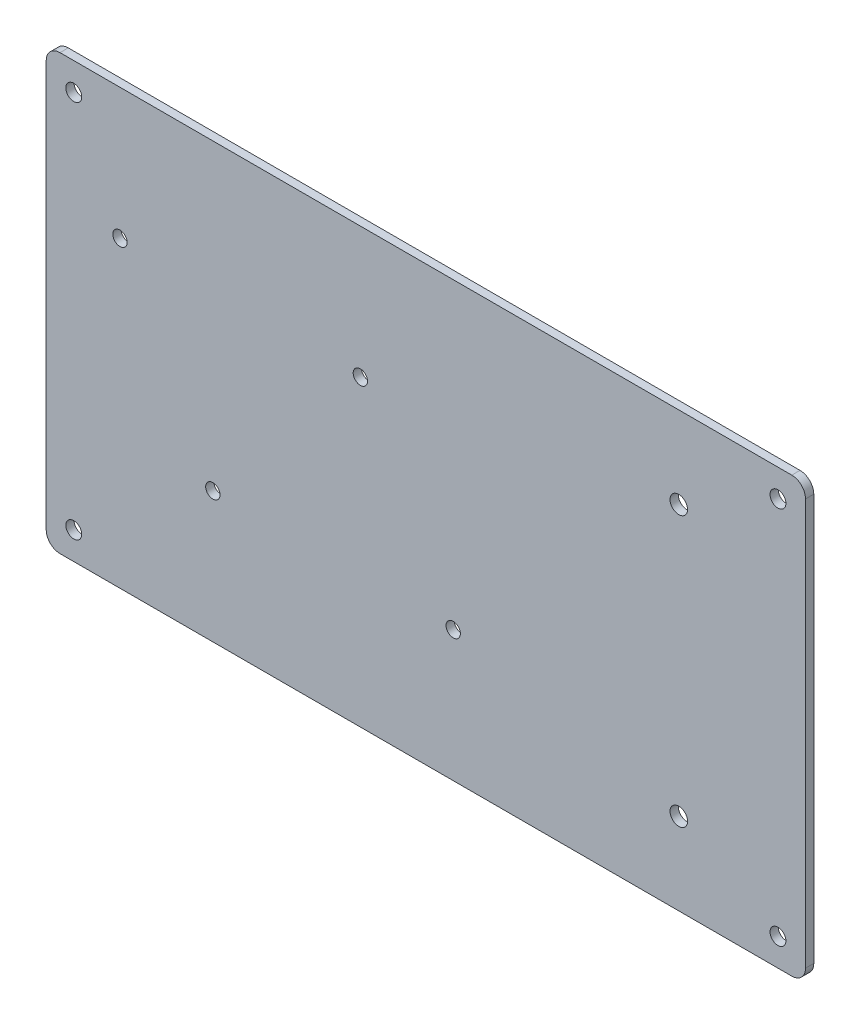
ISO-10303-21;
HEADER;
FILE_DESCRIPTION(('STEP AP214'),'2;1');
FILE_NAME('part.step','',(''),(''),'','','');
FILE_SCHEMA(('AUTOMOTIVE_DESIGN { 1 0 10303 214 1 1 1 1 }'));
ENDSEC;
DATA;
#1=APPLICATION_CONTEXT('core data for automotive mechanical design processes');
#2=APPLICATION_PROTOCOL_DEFINITION('international standard','automotive_design',2000,#1);
#3=PRODUCT_CONTEXT('',#1,'mechanical');
#4=PRODUCT('Part','Part','',(#3));
#5=PRODUCT_RELATED_PRODUCT_CATEGORY('part','',(#4));
#6=PRODUCT_DEFINITION_FORMATION('','',#4);
#7=PRODUCT_DEFINITION_CONTEXT('part definition',#1,'design');
#8=PRODUCT_DEFINITION('design','',#6,#7);
#9=PRODUCT_DEFINITION_SHAPE('','',#8);
#10=(LENGTH_UNIT() NAMED_UNIT(*) SI_UNIT(.MILLI.,.METRE.));
#11=(NAMED_UNIT(*) PLANE_ANGLE_UNIT() SI_UNIT($,.RADIAN.));
#12=(NAMED_UNIT(*) SI_UNIT($,.STERADIAN.) SOLID_ANGLE_UNIT());
#13=UNCERTAINTY_MEASURE_WITH_UNIT(LENGTH_MEASURE(1.E-05),#10,'distance_accuracy_value','');
#14=(GEOMETRIC_REPRESENTATION_CONTEXT(3) GLOBAL_UNCERTAINTY_ASSIGNED_CONTEXT((#13)) GLOBAL_UNIT_ASSIGNED_CONTEXT((#10,
#11,#12)) REPRESENTATION_CONTEXT('',''));
#15=CARTESIAN_POINT('',(0.,0.,0.));
#16=DIRECTION('',(0.,0.,1.));
#17=DIRECTION('',(1.,0.,0.));
#18=AXIS2_PLACEMENT_3D('',#15,#16,#17);
#19=CARTESIAN_POINT('',(87.5,-50.,1.9));
#20=DIRECTION('',(-1.,0.,0.));
#21=DIRECTION('',(0.,0.,1.));
#22=AXIS2_PLACEMENT_3D('',#19,#20,#21);
#23=PLANE('',#22);
#24=DIRECTION('',(0.,1.,0.));
#25=VECTOR('',#24,1.);
#26=CARTESIAN_POINT('',(87.5,-50.,1.9));
#27=LINE('',#26,#25);
#28=CARTESIAN_POINT('',(87.5,-46.825,1.9));
#29=VERTEX_POINT('',#28);
#30=CARTESIAN_POINT('',(87.5,46.825,1.9));
#31=VERTEX_POINT('',#30);
#32=EDGE_CURVE('E132',#29,#31,#27,.T.);
#33=ORIENTED_EDGE('',*,*,#32,.F.);
#34=DIRECTION('',(0.,0.,-1.));
#35=VECTOR('',#34,1.);
#36=CARTESIAN_POINT('',(87.5,-46.825,1.9));
#37=LINE('',#36,#35);
#38=CARTESIAN_POINT('',(87.5,-46.825,0.));
#39=VERTEX_POINT('',#38);
#40=EDGE_CURVE('E116',#29,#39,#37,.T.);
#41=ORIENTED_EDGE('',*,*,#40,.T.);
#42=DIRECTION('',(0.,1.,0.));
#43=VECTOR('',#42,1.);
#44=CARTESIAN_POINT('',(87.5,-50.,0.));
#45=LINE('',#44,#43);
#46=CARTESIAN_POINT('',(87.5,46.825,0.));
#47=VERTEX_POINT('',#46);
#48=EDGE_CURVE('E129',#39,#47,#45,.T.);
#49=ORIENTED_EDGE('',*,*,#48,.T.);
#50=DIRECTION('',(0.,0.,-1.));
#51=VECTOR('',#50,1.);
#52=CARTESIAN_POINT('',(87.5,46.825,1.9));
#53=LINE('',#52,#51);
#54=EDGE_CURVE('E135',#47,#31,#53,.F.);
#55=ORIENTED_EDGE('',*,*,#54,.T.);
#56=EDGE_LOOP('',(#33,#41,#49,#55));
#57=FACE_BOUND('',#56,.T.);
#58=ADVANCED_FACE('F45',(#57),#23,.F.);
#59=CARTESIAN_POINT('',(-87.5,50.,1.9));
#60=DIRECTION('',(0.,-1.,0.));
#61=DIRECTION('',(0.,0.,-1.));
#62=AXIS2_PLACEMENT_3D('',#59,#60,#61);
#63=PLANE('',#62);
#64=DIRECTION('',(-1.,0.,0.));
#65=VECTOR('',#64,1.);
#66=CARTESIAN_POINT('',(-87.5,50.,0.));
#67=LINE('',#66,#65);
#68=CARTESIAN_POINT('',(84.325,50.,0.));
#69=VERTEX_POINT('',#68);
#70=CARTESIAN_POINT('',(-84.325,50.,0.));
#71=VERTEX_POINT('',#70);
#72=EDGE_CURVE('E140',#69,#71,#67,.T.);
#73=ORIENTED_EDGE('',*,*,#72,.T.);
#74=DIRECTION('',(0.,0.,-1.));
#75=VECTOR('',#74,1.);
#76=CARTESIAN_POINT('',(-84.325,50.,1.9));
#77=LINE('',#76,#75);
#78=CARTESIAN_POINT('',(-84.325,50.,1.9));
#79=VERTEX_POINT('',#78);
#80=EDGE_CURVE('E11',#71,#79,#77,.F.);
#81=ORIENTED_EDGE('',*,*,#80,.T.);
#82=DIRECTION('',(-1.,0.,0.));
#83=VECTOR('',#82,1.);
#84=CARTESIAN_POINT('',(-87.5,50.,1.9));
#85=LINE('',#84,#83);
#86=CARTESIAN_POINT('',(84.325,50.,1.9));
#87=VERTEX_POINT('',#86);
#88=EDGE_CURVE('E209',#87,#79,#85,.T.);
#89=ORIENTED_EDGE('',*,*,#88,.F.);
#90=DIRECTION('',(0.,0.,-1.));
#91=VECTOR('',#90,1.);
#92=CARTESIAN_POINT('',(84.325,50.,1.9));
#93=LINE('',#92,#91);
#94=EDGE_CURVE('E54',#87,#69,#93,.T.);
#95=ORIENTED_EDGE('',*,*,#94,.T.);
#96=EDGE_LOOP('',(#73,#81,#89,#95));
#97=FACE_BOUND('',#96,.T.);
#98=ADVANCED_FACE('F207',(#97),#63,.F.);
#99=CARTESIAN_POINT('',(-87.5,-50.,1.9));
#100=DIRECTION('',(1.,0.,0.));
#101=DIRECTION('',(0.,0.,-1.));
#102=AXIS2_PLACEMENT_3D('',#99,#100,#101);
#103=PLANE('',#102);
#104=DIRECTION('',(0.,-1.,0.));
#105=VECTOR('',#104,1.);
#106=CARTESIAN_POINT('',(-87.5,-50.,0.));
#107=LINE('',#106,#105);
#108=CARTESIAN_POINT('',(-87.5,46.825,0.));
#109=VERTEX_POINT('',#108);
#110=CARTESIAN_POINT('',(-87.5,-46.825,0.));
#111=VERTEX_POINT('',#110);
#112=EDGE_CURVE('E146',#109,#111,#107,.T.);
#113=ORIENTED_EDGE('',*,*,#112,.T.);
#114=DIRECTION('',(0.,0.,-1.));
#115=VECTOR('',#114,1.);
#116=CARTESIAN_POINT('',(-87.5,-46.825,1.9));
#117=LINE('',#116,#115);
#118=CARTESIAN_POINT('',(-87.5,-46.825,1.9));
#119=VERTEX_POINT('',#118);
#120=EDGE_CURVE('E61',#111,#119,#117,.F.);
#121=ORIENTED_EDGE('',*,*,#120,.T.);
#122=DIRECTION('',(0.,-1.,0.));
#123=VECTOR('',#122,1.);
#124=CARTESIAN_POINT('',(-87.5,-50.,1.9));
#125=LINE('',#124,#123);
#126=CARTESIAN_POINT('',(-87.5,46.825,1.9));
#127=VERTEX_POINT('',#126);
#128=EDGE_CURVE('E217',#127,#119,#125,.T.);
#129=ORIENTED_EDGE('',*,*,#128,.F.);
#130=DIRECTION('',(0.,0.,-1.));
#131=VECTOR('',#130,1.);
#132=CARTESIAN_POINT('',(-87.5,46.825,1.9));
#133=LINE('',#132,#131);
#134=EDGE_CURVE('E197',#127,#109,#133,.T.);
#135=ORIENTED_EDGE('',*,*,#134,.T.);
#136=EDGE_LOOP('',(#113,#121,#129,#135));
#137=FACE_BOUND('',#136,.T.);
#138=ADVANCED_FACE('F216',(#137),#103,.F.);
#139=CARTESIAN_POINT('',(-87.5,-50.,1.9));
#140=DIRECTION('',(0.,1.,0.));
#141=DIRECTION('',(0.,0.,1.));
#142=AXIS2_PLACEMENT_3D('',#139,#140,#141);
#143=PLANE('',#142);
#144=DIRECTION('',(1.,0.,0.));
#145=VECTOR('',#144,1.);
#146=CARTESIAN_POINT('',(-87.5,-50.,0.));
#147=LINE('',#146,#145);
#148=CARTESIAN_POINT('',(-84.325,-50.,0.));
#149=VERTEX_POINT('',#148);
#150=CARTESIAN_POINT('',(84.325,-50.,0.));
#151=VERTEX_POINT('',#150);
#152=EDGE_CURVE('E157',#149,#151,#147,.T.);
#153=ORIENTED_EDGE('',*,*,#152,.T.);
#154=DIRECTION('',(0.,0.,-1.));
#155=VECTOR('',#154,1.);
#156=CARTESIAN_POINT('',(84.325,-50.,1.9));
#157=LINE('',#156,#155);
#158=CARTESIAN_POINT('',(84.325,-50.,1.9));
#159=VERTEX_POINT('',#158);
#160=EDGE_CURVE('E117',#151,#159,#157,.F.);
#161=ORIENTED_EDGE('',*,*,#160,.T.);
#162=DIRECTION('',(1.,0.,0.));
#163=VECTOR('',#162,1.);
#164=CARTESIAN_POINT('',(-87.5,-50.,1.9));
#165=LINE('',#164,#163);
#166=CARTESIAN_POINT('',(-84.325,-50.,1.9));
#167=VERTEX_POINT('',#166);
#168=EDGE_CURVE('E152',#167,#159,#165,.T.);
#169=ORIENTED_EDGE('',*,*,#168,.F.);
#170=DIRECTION('',(0.,0.,-1.));
#171=VECTOR('',#170,1.);
#172=CARTESIAN_POINT('',(-84.325,-50.,1.9));
#173=LINE('',#172,#171);
#174=EDGE_CURVE('E123',#167,#149,#173,.T.);
#175=ORIENTED_EDGE('',*,*,#174,.T.);
#176=EDGE_LOOP('',(#153,#161,#169,#175));
#177=FACE_BOUND('',#176,.T.);
#178=ADVANCED_FACE('F304',(#177),#143,.F.);
#179=CARTESIAN_POINT('',(0.,0.,1.9));
#180=DIRECTION('',(0.,0.,-1.));
#181=DIRECTION('',(-1.,0.,0.));
#182=AXIS2_PLACEMENT_3D('',#179,#180,#181);
#183=PLANE('',#182);
#184=CARTESIAN_POINT('',(58.2899999999999,31.115,1.9));
#185=DIRECTION('',(0.,0.,1.));
#186=DIRECTION('',(1.,0.,0.));
#187=AXIS2_PLACEMENT_3D('',#184,#185,#186);
#188=CIRCLE('',#187,2.0193);
#189=CARTESIAN_POINT('',(60.3092999999999,31.115,1.9));
#190=VERTEX_POINT('',#189);
#191=EDGE_CURVE('E251',#190,#190,#188,.T.);
#192=ORIENTED_EDGE('',*,*,#191,.F.);
#193=EDGE_LOOP('',(#192));
#194=FACE_BOUND('',#193,.T.);
#195=CARTESIAN_POINT('',(-70.4999999999999,19.85,1.9));
#196=DIRECTION('',(0.,0.,1.));
#197=DIRECTION('',(1.,0.,0.));
#198=AXIS2_PLACEMENT_3D('',#195,#196,#197);
#199=CIRCLE('',#198,1.65000000000002);
#200=CARTESIAN_POINT('',(-68.8499999999998,19.85,1.9));
#201=VERTEX_POINT('',#200);
#202=EDGE_CURVE('E269',#201,#201,#199,.T.);
#203=ORIENTED_EDGE('',*,*,#202,.F.);
#204=EDGE_LOOP('',(#203));
#205=FACE_BOUND('',#204,.T.);
#206=CARTESIAN_POINT('',(6.30000000000004,-19.85,1.9));
#207=DIRECTION('',(0.,0.,1.));
#208=DIRECTION('',(1.,0.,0.));
#209=AXIS2_PLACEMENT_3D('',#206,#207,#208);
#210=CIRCLE('',#209,1.65000000000001);
#211=CARTESIAN_POINT('',(7.95000000000005,-19.85,1.9));
#212=VERTEX_POINT('',#211);
#213=EDGE_CURVE('E260',#212,#212,#210,.T.);
#214=ORIENTED_EDGE('',*,*,#213,.F.);
#215=EDGE_LOOP('',(#214));
#216=FACE_BOUND('',#215,.T.);
#217=CARTESIAN_POINT('',(-15.1,19.85,1.9));
#218=DIRECTION('',(0.,0.,1.));
#219=DIRECTION('',(1.,0.,0.));
#220=AXIS2_PLACEMENT_3D('',#217,#218,#219);
#221=CIRCLE('',#220,1.65);
#222=CARTESIAN_POINT('',(-13.45,19.85,1.9));
#223=VERTEX_POINT('',#222);
#224=EDGE_CURVE('E283',#223,#223,#221,.T.);
#225=ORIENTED_EDGE('',*,*,#224,.F.);
#226=EDGE_LOOP('',(#225));
#227=FACE_BOUND('',#226,.T.);
#228=CARTESIAN_POINT('',(58.2899999999999,-31.115,1.9));
#229=DIRECTION('',(0.,0.,1.));
#230=DIRECTION('',(1.,0.,0.));
#231=AXIS2_PLACEMENT_3D('',#228,#229,#230);
#232=CIRCLE('',#231,2.0193);
#233=CARTESIAN_POINT('',(60.3092999999999,-31.115,1.9));
#234=VERTEX_POINT('',#233);
#235=EDGE_CURVE('E259',#234,#234,#232,.T.);
#236=ORIENTED_EDGE('',*,*,#235,.F.);
#237=EDGE_LOOP('',(#236));
#238=FACE_BOUND('',#237,.T.);
#239=CARTESIAN_POINT('',(-49.0999999999999,-19.85,1.9));
#240=DIRECTION('',(0.,0.,1.));
#241=DIRECTION('',(1.,0.,0.));
#242=AXIS2_PLACEMENT_3D('',#239,#240,#241);
#243=CIRCLE('',#242,1.65);
#244=CARTESIAN_POINT('',(-47.4499999999998,-19.85,1.9));
#245=VERTEX_POINT('',#244);
#246=EDGE_CURVE('E242',#245,#245,#243,.T.);
#247=ORIENTED_EDGE('',*,*,#246,.F.);
#248=EDGE_LOOP('',(#247));
#249=FACE_BOUND('',#248,.T.);
#250=CARTESIAN_POINT('',(81.15,-43.65,1.9));
#251=DIRECTION('',(0.,0.,-1.));
#252=DIRECTION('',(-1.,0.,0.));
#253=AXIS2_PLACEMENT_3D('',#250,#251,#252);
#254=CIRCLE('',#253,1.8288);
#255=CARTESIAN_POINT('',(82.9788,-43.65,1.9));
#256=VERTEX_POINT('',#255);
#257=EDGE_CURVE('E230',#256,#256,#254,.F.);
#258=ORIENTED_EDGE('',*,*,#257,.F.);
#259=EDGE_LOOP('',(#258));
#260=FACE_BOUND('',#259,.T.);
#261=CARTESIAN_POINT('',(-81.15,43.65,1.9));
#262=DIRECTION('',(0.,0.,-1.));
#263=DIRECTION('',(-1.,0.,0.));
#264=AXIS2_PLACEMENT_3D('',#261,#262,#263);
#265=CIRCLE('',#264,1.8288);
#266=CARTESIAN_POINT('',(-79.3212,43.65,1.9));
#267=VERTEX_POINT('',#266);
#268=EDGE_CURVE('E231',#267,#267,#265,.F.);
#269=ORIENTED_EDGE('',*,*,#268,.F.);
#270=EDGE_LOOP('',(#269));
#271=FACE_BOUND('',#270,.T.);
#272=CARTESIAN_POINT('',(-81.15,-43.65,1.9));
#273=DIRECTION('',(0.,0.,-1.));
#274=DIRECTION('',(-1.,0.,0.));
#275=AXIS2_PLACEMENT_3D('',#272,#273,#274);
#276=CIRCLE('',#275,1.8288);
#277=CARTESIAN_POINT('',(-79.3212,-43.65,1.9));
#278=VERTEX_POINT('',#277);
#279=EDGE_CURVE('E235',#278,#278,#276,.F.);
#280=ORIENTED_EDGE('',*,*,#279,.F.);
#281=EDGE_LOOP('',(#280));
#282=FACE_BOUND('',#281,.T.);
#283=CARTESIAN_POINT('',(81.15,43.65,1.9));
#284=DIRECTION('',(0.,0.,-1.));
#285=DIRECTION('',(-1.,0.,0.));
#286=AXIS2_PLACEMENT_3D('',#283,#284,#285);
#287=CIRCLE('',#286,1.8288);
#288=CARTESIAN_POINT('',(82.9788,43.65,1.9));
#289=VERTEX_POINT('',#288);
#290=EDGE_CURVE('E165',#289,#289,#287,.F.);
#291=ORIENTED_EDGE('',*,*,#290,.F.);
#292=EDGE_LOOP('',(#291));
#293=FACE_BOUND('',#292,.T.);
#294=ORIENTED_EDGE('',*,*,#168,.T.);
#295=CARTESIAN_POINT('',(84.325,-46.825,1.9));
#296=DIRECTION('',(0.,0.,-1.));
#297=DIRECTION('',(-1.,0.,0.));
#298=AXIS2_PLACEMENT_3D('',#295,#296,#297);
#299=CIRCLE('',#298,3.175);
#300=EDGE_CURVE('E194',#159,#29,#299,.F.);
#301=ORIENTED_EDGE('',*,*,#300,.T.);
#302=ORIENTED_EDGE('',*,*,#32,.T.);
#303=CARTESIAN_POINT('',(84.325,46.825,1.9));
#304=DIRECTION('',(0.,0.,-1.));
#305=DIRECTION('',(-1.,0.,0.));
#306=AXIS2_PLACEMENT_3D('',#303,#304,#305);
#307=CIRCLE('',#306,3.175);
#308=EDGE_CURVE('E186',#31,#87,#307,.F.);
#309=ORIENTED_EDGE('',*,*,#308,.T.);
#310=ORIENTED_EDGE('',*,*,#88,.T.);
#311=CARTESIAN_POINT('',(-84.325,46.825,1.9));
#312=DIRECTION('',(0.,0.,-1.));
#313=DIRECTION('',(-1.,0.,0.));
#314=AXIS2_PLACEMENT_3D('',#311,#312,#313);
#315=CIRCLE('',#314,3.175);
#316=EDGE_CURVE('E68',#79,#127,#315,.F.);
#317=ORIENTED_EDGE('',*,*,#316,.T.);
#318=ORIENTED_EDGE('',*,*,#128,.T.);
#319=CARTESIAN_POINT('',(-84.325,-46.825,1.9));
#320=DIRECTION('',(0.,0.,-1.));
#321=DIRECTION('',(-1.,0.,0.));
#322=AXIS2_PLACEMENT_3D('',#319,#320,#321);
#323=CIRCLE('',#322,3.175);
#324=EDGE_CURVE('E191',#119,#167,#323,.F.);
#325=ORIENTED_EDGE('',*,*,#324,.T.);
#326=EDGE_LOOP('',(#294,#301,#302,#309,#310,#317,#318,#325));
#327=FACE_BOUND('',#326,.T.);
#328=ADVANCED_FACE('F301',(#194,#205,#216,#227,#238,#249,#260,#271,#282,#293,#327),#183,.F.);
#329=CARTESIAN_POINT('',(0.,0.,0.));
#330=DIRECTION('',(0.,0.,-1.));
#331=DIRECTION('',(-1.,0.,0.));
#332=AXIS2_PLACEMENT_3D('',#329,#330,#331);
#333=PLANE('',#332);
#334=CARTESIAN_POINT('',(58.2899999999999,31.115,0.));
#335=DIRECTION('',(0.,0.,-1.));
#336=DIRECTION('',(-1.,0.,0.));
#337=AXIS2_PLACEMENT_3D('',#334,#335,#336);
#338=CIRCLE('',#337,2.0193);
#339=CARTESIAN_POINT('',(56.2706999999999,31.115,0.));
#340=VERTEX_POINT('',#339);
#341=EDGE_CURVE('E255',#340,#340,#338,.F.);
#342=ORIENTED_EDGE('',*,*,#341,.T.);
#343=EDGE_LOOP('',(#342));
#344=FACE_BOUND('',#343,.T.);
#345=CARTESIAN_POINT('',(-70.4999999999999,19.85,0.));
#346=DIRECTION('',(0.,0.,-1.));
#347=DIRECTION('',(-1.,0.,0.));
#348=AXIS2_PLACEMENT_3D('',#345,#346,#347);
#349=CIRCLE('',#348,1.65000000000002);
#350=CARTESIAN_POINT('',(-72.1499999999999,19.85,0.));
#351=VERTEX_POINT('',#350);
#352=EDGE_CURVE('E247',#351,#351,#349,.F.);
#353=ORIENTED_EDGE('',*,*,#352,.T.);
#354=EDGE_LOOP('',(#353));
#355=FACE_BOUND('',#354,.T.);
#356=CARTESIAN_POINT('',(6.30000000000004,-19.85,0.));
#357=DIRECTION('',(0.,0.,-1.));
#358=DIRECTION('',(-1.,0.,0.));
#359=AXIS2_PLACEMENT_3D('',#356,#357,#358);
#360=CIRCLE('',#359,1.65000000000001);
#361=CARTESIAN_POINT('',(4.65000000000004,-19.85,0.));
#362=VERTEX_POINT('',#361);
#363=EDGE_CURVE('E264',#362,#362,#360,.F.);
#364=ORIENTED_EDGE('',*,*,#363,.T.);
#365=EDGE_LOOP('',(#364));
#366=FACE_BOUND('',#365,.T.);
#367=CARTESIAN_POINT('',(-15.1,19.85,0.));
#368=DIRECTION('',(0.,0.,-1.));
#369=DIRECTION('',(-1.,0.,0.));
#370=AXIS2_PLACEMENT_3D('',#367,#368,#369);
#371=CIRCLE('',#370,1.65);
#372=CARTESIAN_POINT('',(-16.75,19.85,0.));
#373=VERTEX_POINT('',#372);
#374=EDGE_CURVE('E265',#373,#373,#371,.F.);
#375=ORIENTED_EDGE('',*,*,#374,.T.);
#376=EDGE_LOOP('',(#375));
#377=FACE_BOUND('',#376,.T.);
#378=CARTESIAN_POINT('',(58.2899999999999,-31.115,0.));
#379=DIRECTION('',(0.,0.,-1.));
#380=DIRECTION('',(-1.,0.,0.));
#381=AXIS2_PLACEMENT_3D('',#378,#379,#380);
#382=CIRCLE('',#381,2.0193);
#383=CARTESIAN_POINT('',(56.2706999999999,-31.115,0.));
#384=VERTEX_POINT('',#383);
#385=EDGE_CURVE('E279',#384,#384,#382,.F.);
#386=ORIENTED_EDGE('',*,*,#385,.T.);
#387=EDGE_LOOP('',(#386));
#388=FACE_BOUND('',#387,.T.);
#389=CARTESIAN_POINT('',(-49.0999999999999,-19.85,0.));
#390=DIRECTION('',(0.,0.,-1.));
#391=DIRECTION('',(-1.,0.,0.));
#392=AXIS2_PLACEMENT_3D('',#389,#390,#391);
#393=CIRCLE('',#392,1.65);
#394=CARTESIAN_POINT('',(-50.7499999999999,-19.85,0.));
#395=VERTEX_POINT('',#394);
#396=EDGE_CURVE('E243',#395,#395,#393,.F.);
#397=ORIENTED_EDGE('',*,*,#396,.T.);
#398=EDGE_LOOP('',(#397));
#399=FACE_BOUND('',#398,.T.);
#400=CARTESIAN_POINT('',(81.15,-43.65,0.));
#401=DIRECTION('',(0.,0.,-1.));
#402=DIRECTION('',(-1.,0.,0.));
#403=AXIS2_PLACEMENT_3D('',#400,#401,#402);
#404=CIRCLE('',#403,1.8288);
#405=CARTESIAN_POINT('',(82.9788,-43.65,0.));
#406=VERTEX_POINT('',#405);
#407=EDGE_CURVE('E141',#406,#406,#404,.F.);
#408=ORIENTED_EDGE('',*,*,#407,.T.);
#409=EDGE_LOOP('',(#408));
#410=FACE_BOUND('',#409,.T.);
#411=CARTESIAN_POINT('',(-81.15,43.65,0.));
#412=DIRECTION('',(0.,0.,-1.));
#413=DIRECTION('',(-1.,0.,0.));
#414=AXIS2_PLACEMENT_3D('',#411,#412,#413);
#415=CIRCLE('',#414,1.8288);
#416=CARTESIAN_POINT('',(-79.3212,43.65,0.));
#417=VERTEX_POINT('',#416);
#418=EDGE_CURVE('E149',#417,#417,#415,.F.);
#419=ORIENTED_EDGE('',*,*,#418,.T.);
#420=EDGE_LOOP('',(#419));
#421=FACE_BOUND('',#420,.T.);
#422=CARTESIAN_POINT('',(-81.15,-43.65,0.));
#423=DIRECTION('',(0.,0.,-1.));
#424=DIRECTION('',(-1.,0.,0.));
#425=AXIS2_PLACEMENT_3D('',#422,#423,#424);
#426=CIRCLE('',#425,1.8288);
#427=CARTESIAN_POINT('',(-79.3212,-43.65,0.));
#428=VERTEX_POINT('',#427);
#429=EDGE_CURVE('E164',#428,#428,#426,.F.);
#430=ORIENTED_EDGE('',*,*,#429,.T.);
#431=EDGE_LOOP('',(#430));
#432=FACE_BOUND('',#431,.T.);
#433=CARTESIAN_POINT('',(81.15,43.65,0.));
#434=DIRECTION('',(0.,0.,-1.));
#435=DIRECTION('',(-1.,0.,0.));
#436=AXIS2_PLACEMENT_3D('',#433,#434,#435);
#437=CIRCLE('',#436,1.8288);
#438=CARTESIAN_POINT('',(82.9788,43.65,0.));
#439=VERTEX_POINT('',#438);
#440=EDGE_CURVE('E160',#439,#439,#437,.F.);
#441=ORIENTED_EDGE('',*,*,#440,.T.);
#442=EDGE_LOOP('',(#441));
#443=FACE_BOUND('',#442,.T.);
#444=ORIENTED_EDGE('',*,*,#48,.F.);
#445=CARTESIAN_POINT('',(84.325,-46.825,0.));
#446=DIRECTION('',(0.,0.,-1.));
#447=DIRECTION('',(-1.,0.,0.));
#448=AXIS2_PLACEMENT_3D('',#445,#446,#447);
#449=CIRCLE('',#448,3.175);
#450=EDGE_CURVE('E112',#39,#151,#449,.T.);
#451=ORIENTED_EDGE('',*,*,#450,.T.);
#452=ORIENTED_EDGE('',*,*,#152,.F.);
#453=CARTESIAN_POINT('',(-84.325,-46.825,0.));
#454=DIRECTION('',(0.,0.,-1.));
#455=DIRECTION('',(-1.,0.,0.));
#456=AXIS2_PLACEMENT_3D('',#453,#454,#455);
#457=CIRCLE('',#456,3.175);
#458=EDGE_CURVE('E124',#149,#111,#457,.T.);
#459=ORIENTED_EDGE('',*,*,#458,.T.);
#460=ORIENTED_EDGE('',*,*,#112,.F.);
#461=CARTESIAN_POINT('',(-84.325,46.825,0.));
#462=DIRECTION('',(0.,0.,-1.));
#463=DIRECTION('',(-1.,0.,0.));
#464=AXIS2_PLACEMENT_3D('',#461,#462,#463);
#465=CIRCLE('',#464,3.175);
#466=EDGE_CURVE('E176',#109,#71,#465,.T.);
#467=ORIENTED_EDGE('',*,*,#466,.T.);
#468=ORIENTED_EDGE('',*,*,#72,.F.);
#469=CARTESIAN_POINT('',(84.325,46.825,0.));
#470=DIRECTION('',(0.,0.,-1.));
#471=DIRECTION('',(-1.,0.,0.));
#472=AXIS2_PLACEMENT_3D('',#469,#470,#471);
#473=CIRCLE('',#472,3.175);
#474=EDGE_CURVE('E134',#69,#47,#473,.T.);
#475=ORIENTED_EDGE('',*,*,#474,.T.);
#476=EDGE_LOOP('',(#444,#451,#452,#459,#460,#467,#468,#475));
#477=FACE_BOUND('',#476,.T.);
#478=ADVANCED_FACE('F137',(#344,#355,#366,#377,#388,#399,#410,#421,#432,#443,#477),#333,.T.);
#479=CARTESIAN_POINT('',(81.15,43.65,-1.2E-05));
#480=DIRECTION('',(0.,0.,1.));
#481=DIRECTION('',(1.,0.,0.));
#482=AXIS2_PLACEMENT_3D('',#479,#480,#481);
#483=CYLINDRICAL_SURFACE('',#482,1.8288);
#484=CARTESIAN_POINT('',(82.9788,43.65,0.));
#485=CARTESIAN_POINT('',(82.9788,43.65,0.0197916666666667));
#486=CARTESIAN_POINT('',(82.9788,43.65,0.0395833333333334));
#487=CARTESIAN_POINT('',(82.9788,43.65,0.0791666666666667));
#488=CARTESIAN_POINT('',(82.9788,43.65,0.0989583333333333));
#489=CARTESIAN_POINT('',(82.9788,43.65,0.138541666666667));
#490=CARTESIAN_POINT('',(82.9788,43.65,0.158333333333333));
#491=CARTESIAN_POINT('',(82.9788,43.65,0.197916666666667));
#492=CARTESIAN_POINT('',(82.9788,43.65,0.217708333333333));
#493=CARTESIAN_POINT('',(82.9788,43.65,0.257291666666667));
#494=CARTESIAN_POINT('',(82.9788,43.65,0.277083333333333));
#495=CARTESIAN_POINT('',(82.9788,43.65,0.316666666666667));
#496=CARTESIAN_POINT('',(82.9788,43.65,0.336458333333333));
#497=CARTESIAN_POINT('',(82.9788,43.65,0.376041666666667));
#498=CARTESIAN_POINT('',(82.9788,43.65,0.395833333333333));
#499=CARTESIAN_POINT('',(82.9788,43.65,0.435416666666667));
#500=CARTESIAN_POINT('',(82.9788,43.65,0.455208333333333));
#501=CARTESIAN_POINT('',(82.9788,43.65,0.494791666666667));
#502=CARTESIAN_POINT('',(82.9788,43.65,0.514583333333333));
#503=CARTESIAN_POINT('',(82.9788,43.65,0.554166666666667));
#504=CARTESIAN_POINT('',(82.9788,43.65,0.573958333333333));
#505=CARTESIAN_POINT('',(82.9788,43.65,0.613541666666667));
#506=CARTESIAN_POINT('',(82.9788,43.65,0.633333333333333));
#507=CARTESIAN_POINT('',(82.9788,43.65,0.672916666666667));
#508=CARTESIAN_POINT('',(82.9788,43.65,0.692708333333333));
#509=CARTESIAN_POINT('',(82.9788,43.65,0.732291666666667));
#510=CARTESIAN_POINT('',(82.9788,43.65,0.752083333333333));
#511=CARTESIAN_POINT('',(82.9788,43.65,0.791666666666667));
#512=CARTESIAN_POINT('',(82.9788,43.65,0.811458333333333));
#513=CARTESIAN_POINT('',(82.9788,43.65,0.851041666666667));
#514=CARTESIAN_POINT('',(82.9788,43.65,0.870833333333333));
#515=CARTESIAN_POINT('',(82.9788,43.65,0.910416666666667));
#516=CARTESIAN_POINT('',(82.9788,43.65,0.930208333333333));
#517=CARTESIAN_POINT('',(82.9788,43.65,0.969791666666667));
#518=CARTESIAN_POINT('',(82.9788,43.65,0.989583333333333));
#519=CARTESIAN_POINT('',(82.9788,43.65,1.02916666666667));
#520=CARTESIAN_POINT('',(82.9788,43.65,1.04895833333333));
#521=CARTESIAN_POINT('',(82.9788,43.65,1.08854166666667));
#522=CARTESIAN_POINT('',(82.9788,43.65,1.10833333333333));
#523=CARTESIAN_POINT('',(82.9788,43.65,1.14791666666667));
#524=CARTESIAN_POINT('',(82.9788,43.65,1.16770833333333));
#525=CARTESIAN_POINT('',(82.9788,43.65,1.20729166666667));
#526=CARTESIAN_POINT('',(82.9788,43.65,1.22708333333333));
#527=CARTESIAN_POINT('',(82.9788,43.65,1.26666666666667));
#528=CARTESIAN_POINT('',(82.9788,43.65,1.28645833333333));
#529=CARTESIAN_POINT('',(82.9788,43.65,1.32604166666667));
#530=CARTESIAN_POINT('',(82.9788,43.65,1.34583333333333));
#531=CARTESIAN_POINT('',(82.9788,43.65,1.38541666666667));
#532=CARTESIAN_POINT('',(82.9788,43.65,1.40520833333333));
#533=CARTESIAN_POINT('',(82.9788,43.65,1.44479166666667));
#534=CARTESIAN_POINT('',(82.9788,43.65,1.46458333333333));
#535=CARTESIAN_POINT('',(82.9788,43.65,1.50416666666667));
#536=CARTESIAN_POINT('',(82.9788,43.65,1.52395833333333));
#537=CARTESIAN_POINT('',(82.9788,43.65,1.56354166666667));
#538=CARTESIAN_POINT('',(82.9788,43.65,1.58333333333333));
#539=CARTESIAN_POINT('',(82.9788,43.65,1.62291666666667));
#540=CARTESIAN_POINT('',(82.9788,43.65,1.64270833333333));
#541=CARTESIAN_POINT('',(82.9788,43.65,1.68229166666667));
#542=CARTESIAN_POINT('',(82.9788,43.65,1.70208333333333));
#543=CARTESIAN_POINT('',(82.9788,43.65,1.74166666666667));
#544=CARTESIAN_POINT('',(82.9788,43.65,1.76145833333333));
#545=CARTESIAN_POINT('',(82.9788,43.65,1.80104166666667));
#546=CARTESIAN_POINT('',(82.9788,43.65,1.82083333333333));
#547=CARTESIAN_POINT('',(82.9788,43.65,1.86041666666667));
#548=CARTESIAN_POINT('',(82.9788,43.65,1.88020833333333));
#549=CARTESIAN_POINT('',(82.9788,43.65,1.9));
#550=B_SPLINE_CURVE_WITH_KNOTS('',3,(#484,#485,#486,#487,#488,#489,#490,#491,#492,#493,#494,
#495,#496,#497,#498,#499,#500,#501,#502,#503,#504,#505,#506,#507,#508,#509,#510,#511,#512,#513,
#514,#515,#516,#517,#518,#519,#520,#521,#522,#523,#524,#525,#526,#527,#528,#529,#530,#531,#532,
#533,#534,#535,#536,#537,#538,#539,#540,#541,#542,#543,#544,#545,#546,#547,#548,#549),
.UNSPECIFIED.,.F.,.F.,(4,2,2,2,2,2,2,2,2,2,2,2,2,2,2,2,2,2,2,2,2,2,2,2,2,2,2,2,2,2,2,2,4),(0.,
0.059375,0.11875,0.178125,0.2375,0.296875,0.35625,0.415625,0.475,0.534375,0.59375,0.653125,
0.7125,0.771875,0.83125,0.890625,0.95,1.009375,1.06875,1.128125,1.1875,1.246875,1.30625,
1.365625,1.425,1.484375,1.54375,1.603125,1.6625,1.721875,1.78125,1.840625,1.9),.UNSPECIFIED.);
#551=EDGE_CURVE('BSEAM344',#439,#289,#550,.T.);
#552=ORIENTED_EDGE('',*,*,#440,.F.);
#553=ORIENTED_EDGE('',*,*,#290,.T.);
#554=ORIENTED_EDGE('',*,*,#551,.T.);
#555=ORIENTED_EDGE('',*,*,#551,.F.);
#556=EDGE_LOOP('',(#552,#554,#553,#555));
#557=FACE_BOUND('',#556,.T.);
#558=ADVANCED_FACE('F344',(#557),#483,.F.);
#559=CARTESIAN_POINT('',(-81.15,-43.65,-1.2E-05));
#560=DIRECTION('',(0.,0.,1.));
#561=DIRECTION('',(1.,0.,0.));
#562=AXIS2_PLACEMENT_3D('',#559,#560,#561);
#563=CYLINDRICAL_SURFACE('',#562,1.8288);
#564=CARTESIAN_POINT('',(-79.3212,-43.65,0.));
#565=CARTESIAN_POINT('',(-79.3212,-43.65,0.0197916666666667));
#566=CARTESIAN_POINT('',(-79.3212,-43.65,0.0395833333333334));
#567=CARTESIAN_POINT('',(-79.3212,-43.65,0.0791666666666667));
#568=CARTESIAN_POINT('',(-79.3212,-43.65,0.0989583333333333));
#569=CARTESIAN_POINT('',(-79.3212,-43.65,0.138541666666667));
#570=CARTESIAN_POINT('',(-79.3212,-43.65,0.158333333333333));
#571=CARTESIAN_POINT('',(-79.3212,-43.65,0.197916666666667));
#572=CARTESIAN_POINT('',(-79.3212,-43.65,0.217708333333333));
#573=CARTESIAN_POINT('',(-79.3212,-43.65,0.257291666666667));
#574=CARTESIAN_POINT('',(-79.3212,-43.65,0.277083333333333));
#575=CARTESIAN_POINT('',(-79.3212,-43.65,0.316666666666667));
#576=CARTESIAN_POINT('',(-79.3212,-43.65,0.336458333333333));
#577=CARTESIAN_POINT('',(-79.3212,-43.65,0.376041666666667));
#578=CARTESIAN_POINT('',(-79.3212,-43.65,0.395833333333333));
#579=CARTESIAN_POINT('',(-79.3212,-43.65,0.435416666666667));
#580=CARTESIAN_POINT('',(-79.3212,-43.65,0.455208333333333));
#581=CARTESIAN_POINT('',(-79.3212,-43.65,0.494791666666667));
#582=CARTESIAN_POINT('',(-79.3212,-43.65,0.514583333333333));
#583=CARTESIAN_POINT('',(-79.3212,-43.65,0.554166666666667));
#584=CARTESIAN_POINT('',(-79.3212,-43.65,0.573958333333333));
#585=CARTESIAN_POINT('',(-79.3212,-43.65,0.613541666666667));
#586=CARTESIAN_POINT('',(-79.3212,-43.65,0.633333333333333));
#587=CARTESIAN_POINT('',(-79.3212,-43.65,0.672916666666667));
#588=CARTESIAN_POINT('',(-79.3212,-43.65,0.692708333333333));
#589=CARTESIAN_POINT('',(-79.3212,-43.65,0.732291666666667));
#590=CARTESIAN_POINT('',(-79.3212,-43.65,0.752083333333333));
#591=CARTESIAN_POINT('',(-79.3212,-43.65,0.791666666666667));
#592=CARTESIAN_POINT('',(-79.3212,-43.65,0.811458333333333));
#593=CARTESIAN_POINT('',(-79.3212,-43.65,0.851041666666667));
#594=CARTESIAN_POINT('',(-79.3212,-43.65,0.870833333333333));
#595=CARTESIAN_POINT('',(-79.3212,-43.65,0.910416666666667));
#596=CARTESIAN_POINT('',(-79.3212,-43.65,0.930208333333333));
#597=CARTESIAN_POINT('',(-79.3212,-43.65,0.969791666666667));
#598=CARTESIAN_POINT('',(-79.3212,-43.65,0.989583333333333));
#599=CARTESIAN_POINT('',(-79.3212,-43.65,1.02916666666667));
#600=CARTESIAN_POINT('',(-79.3212,-43.65,1.04895833333333));
#601=CARTESIAN_POINT('',(-79.3212,-43.65,1.08854166666667));
#602=CARTESIAN_POINT('',(-79.3212,-43.65,1.10833333333333));
#603=CARTESIAN_POINT('',(-79.3212,-43.65,1.14791666666667));
#604=CARTESIAN_POINT('',(-79.3212,-43.65,1.16770833333333));
#605=CARTESIAN_POINT('',(-79.3212,-43.65,1.20729166666667));
#606=CARTESIAN_POINT('',(-79.3212,-43.65,1.22708333333333));
#607=CARTESIAN_POINT('',(-79.3212,-43.65,1.26666666666667));
#608=CARTESIAN_POINT('',(-79.3212,-43.65,1.28645833333333));
#609=CARTESIAN_POINT('',(-79.3212,-43.65,1.32604166666667));
#610=CARTESIAN_POINT('',(-79.3212,-43.65,1.34583333333333));
#611=CARTESIAN_POINT('',(-79.3212,-43.65,1.38541666666667));
#612=CARTESIAN_POINT('',(-79.3212,-43.65,1.40520833333333));
#613=CARTESIAN_POINT('',(-79.3212,-43.65,1.44479166666667));
#614=CARTESIAN_POINT('',(-79.3212,-43.65,1.46458333333333));
#615=CARTESIAN_POINT('',(-79.3212,-43.65,1.50416666666667));
#616=CARTESIAN_POINT('',(-79.3212,-43.65,1.52395833333333));
#617=CARTESIAN_POINT('',(-79.3212,-43.65,1.56354166666667));
#618=CARTESIAN_POINT('',(-79.3212,-43.65,1.58333333333333));
#619=CARTESIAN_POINT('',(-79.3212,-43.65,1.62291666666667));
#620=CARTESIAN_POINT('',(-79.3212,-43.65,1.64270833333333));
#621=CARTESIAN_POINT('',(-79.3212,-43.65,1.68229166666667));
#622=CARTESIAN_POINT('',(-79.3212,-43.65,1.70208333333333));
#623=CARTESIAN_POINT('',(-79.3212,-43.65,1.74166666666667));
#624=CARTESIAN_POINT('',(-79.3212,-43.65,1.76145833333333));
#625=CARTESIAN_POINT('',(-79.3212,-43.65,1.80104166666667));
#626=CARTESIAN_POINT('',(-79.3212,-43.65,1.82083333333333));
#627=CARTESIAN_POINT('',(-79.3212,-43.65,1.86041666666667));
#628=CARTESIAN_POINT('',(-79.3212,-43.65,1.88020833333333));
#629=CARTESIAN_POINT('',(-79.3212,-43.65,1.9));
#630=B_SPLINE_CURVE_WITH_KNOTS('',3,(#564,#565,#566,#567,#568,#569,#570,#571,#572,#573,#574,
#575,#576,#577,#578,#579,#580,#581,#582,#583,#584,#585,#586,#587,#588,#589,#590,#591,#592,#593,
#594,#595,#596,#597,#598,#599,#600,#601,#602,#603,#604,#605,#606,#607,#608,#609,#610,#611,#612,
#613,#614,#615,#616,#617,#618,#619,#620,#621,#622,#623,#624,#625,#626,#627,#628,#629),
.UNSPECIFIED.,.F.,.F.,(4,2,2,2,2,2,2,2,2,2,2,2,2,2,2,2,2,2,2,2,2,2,2,2,2,2,2,2,2,2,2,2,4),(0.,
0.059375,0.11875,0.178125,0.2375,0.296875,0.35625,0.415625,0.475,0.534375,0.59375,0.653125,
0.7125,0.771875,0.83125,0.890625,0.95,1.009375,1.06875,1.128125,1.1875,1.246875,1.30625,
1.365625,1.425,1.484375,1.54375,1.603125,1.6625,1.721875,1.78125,1.840625,1.9),.UNSPECIFIED.);
#631=EDGE_CURVE('BSEAM349',#428,#278,#630,.T.);
#632=ORIENTED_EDGE('',*,*,#429,.F.);
#633=ORIENTED_EDGE('',*,*,#279,.T.);
#634=ORIENTED_EDGE('',*,*,#631,.T.);
#635=ORIENTED_EDGE('',*,*,#631,.F.);
#636=EDGE_LOOP('',(#632,#634,#633,#635));
#637=FACE_BOUND('',#636,.T.);
#638=ADVANCED_FACE('F349',(#637),#563,.F.);
#639=CARTESIAN_POINT('',(-81.15,43.65,-1.2E-05));
#640=DIRECTION('',(0.,0.,1.));
#641=DIRECTION('',(1.,0.,0.));
#642=AXIS2_PLACEMENT_3D('',#639,#640,#641);
#643=CYLINDRICAL_SURFACE('',#642,1.8288);
#644=CARTESIAN_POINT('',(-79.3212,43.65,0.));
#645=CARTESIAN_POINT('',(-79.3212,43.65,0.0197916666666667));
#646=CARTESIAN_POINT('',(-79.3212,43.65,0.0395833333333334));
#647=CARTESIAN_POINT('',(-79.3212,43.65,0.0791666666666667));
#648=CARTESIAN_POINT('',(-79.3212,43.65,0.0989583333333333));
#649=CARTESIAN_POINT('',(-79.3212,43.65,0.138541666666667));
#650=CARTESIAN_POINT('',(-79.3212,43.65,0.158333333333333));
#651=CARTESIAN_POINT('',(-79.3212,43.65,0.197916666666667));
#652=CARTESIAN_POINT('',(-79.3212,43.65,0.217708333333333));
#653=CARTESIAN_POINT('',(-79.3212,43.65,0.257291666666667));
#654=CARTESIAN_POINT('',(-79.3212,43.65,0.277083333333333));
#655=CARTESIAN_POINT('',(-79.3212,43.65,0.316666666666667));
#656=CARTESIAN_POINT('',(-79.3212,43.65,0.336458333333333));
#657=CARTESIAN_POINT('',(-79.3212,43.65,0.376041666666667));
#658=CARTESIAN_POINT('',(-79.3212,43.65,0.395833333333333));
#659=CARTESIAN_POINT('',(-79.3212,43.65,0.435416666666667));
#660=CARTESIAN_POINT('',(-79.3212,43.65,0.455208333333333));
#661=CARTESIAN_POINT('',(-79.3212,43.65,0.494791666666667));
#662=CARTESIAN_POINT('',(-79.3212,43.65,0.514583333333333));
#663=CARTESIAN_POINT('',(-79.3212,43.65,0.554166666666667));
#664=CARTESIAN_POINT('',(-79.3212,43.65,0.573958333333333));
#665=CARTESIAN_POINT('',(-79.3212,43.65,0.613541666666667));
#666=CARTESIAN_POINT('',(-79.3212,43.65,0.633333333333333));
#667=CARTESIAN_POINT('',(-79.3212,43.65,0.672916666666667));
#668=CARTESIAN_POINT('',(-79.3212,43.65,0.692708333333333));
#669=CARTESIAN_POINT('',(-79.3212,43.65,0.732291666666667));
#670=CARTESIAN_POINT('',(-79.3212,43.65,0.752083333333333));
#671=CARTESIAN_POINT('',(-79.3212,43.65,0.791666666666667));
#672=CARTESIAN_POINT('',(-79.3212,43.65,0.811458333333333));
#673=CARTESIAN_POINT('',(-79.3212,43.65,0.851041666666667));
#674=CARTESIAN_POINT('',(-79.3212,43.65,0.870833333333333));
#675=CARTESIAN_POINT('',(-79.3212,43.65,0.910416666666667));
#676=CARTESIAN_POINT('',(-79.3212,43.65,0.930208333333333));
#677=CARTESIAN_POINT('',(-79.3212,43.65,0.969791666666667));
#678=CARTESIAN_POINT('',(-79.3212,43.65,0.989583333333333));
#679=CARTESIAN_POINT('',(-79.3212,43.65,1.02916666666667));
#680=CARTESIAN_POINT('',(-79.3212,43.65,1.04895833333333));
#681=CARTESIAN_POINT('',(-79.3212,43.65,1.08854166666667));
#682=CARTESIAN_POINT('',(-79.3212,43.65,1.10833333333333));
#683=CARTESIAN_POINT('',(-79.3212,43.65,1.14791666666667));
#684=CARTESIAN_POINT('',(-79.3212,43.65,1.16770833333333));
#685=CARTESIAN_POINT('',(-79.3212,43.65,1.20729166666667));
#686=CARTESIAN_POINT('',(-79.3212,43.65,1.22708333333333));
#687=CARTESIAN_POINT('',(-79.3212,43.65,1.26666666666667));
#688=CARTESIAN_POINT('',(-79.3212,43.65,1.28645833333333));
#689=CARTESIAN_POINT('',(-79.3212,43.65,1.32604166666667));
#690=CARTESIAN_POINT('',(-79.3212,43.65,1.34583333333333));
#691=CARTESIAN_POINT('',(-79.3212,43.65,1.38541666666667));
#692=CARTESIAN_POINT('',(-79.3212,43.65,1.40520833333333));
#693=CARTESIAN_POINT('',(-79.3212,43.65,1.44479166666667));
#694=CARTESIAN_POINT('',(-79.3212,43.65,1.46458333333333));
#695=CARTESIAN_POINT('',(-79.3212,43.65,1.50416666666667));
#696=CARTESIAN_POINT('',(-79.3212,43.65,1.52395833333333));
#697=CARTESIAN_POINT('',(-79.3212,43.65,1.56354166666667));
#698=CARTESIAN_POINT('',(-79.3212,43.65,1.58333333333333));
#699=CARTESIAN_POINT('',(-79.3212,43.65,1.62291666666667));
#700=CARTESIAN_POINT('',(-79.3212,43.65,1.64270833333333));
#701=CARTESIAN_POINT('',(-79.3212,43.65,1.68229166666667));
#702=CARTESIAN_POINT('',(-79.3212,43.65,1.70208333333333));
#703=CARTESIAN_POINT('',(-79.3212,43.65,1.74166666666667));
#704=CARTESIAN_POINT('',(-79.3212,43.65,1.76145833333333));
#705=CARTESIAN_POINT('',(-79.3212,43.65,1.80104166666667));
#706=CARTESIAN_POINT('',(-79.3212,43.65,1.82083333333333));
#707=CARTESIAN_POINT('',(-79.3212,43.65,1.86041666666667));
#708=CARTESIAN_POINT('',(-79.3212,43.65,1.88020833333333));
#709=CARTESIAN_POINT('',(-79.3212,43.65,1.9));
#710=B_SPLINE_CURVE_WITH_KNOTS('',3,(#644,#645,#646,#647,#648,#649,#650,#651,#652,#653,#654,
#655,#656,#657,#658,#659,#660,#661,#662,#663,#664,#665,#666,#667,#668,#669,#670,#671,#672,#673,
#674,#675,#676,#677,#678,#679,#680,#681,#682,#683,#684,#685,#686,#687,#688,#689,#690,#691,#692,
#693,#694,#695,#696,#697,#698,#699,#700,#701,#702,#703,#704,#705,#706,#707,#708,#709),
.UNSPECIFIED.,.F.,.F.,(4,2,2,2,2,2,2,2,2,2,2,2,2,2,2,2,2,2,2,2,2,2,2,2,2,2,2,2,2,2,2,2,4),(0.,
0.059375,0.11875,0.178125,0.2375,0.296875,0.35625,0.415625,0.475,0.534375,0.59375,0.653125,
0.7125,0.771875,0.83125,0.890625,0.95,1.009375,1.06875,1.128125,1.1875,1.246875,1.30625,
1.365625,1.425,1.484375,1.54375,1.603125,1.6625,1.721875,1.78125,1.840625,1.9),.UNSPECIFIED.);
#711=EDGE_CURVE('BSEAM351',#417,#267,#710,.T.);
#712=ORIENTED_EDGE('',*,*,#418,.F.);
#713=ORIENTED_EDGE('',*,*,#268,.T.);
#714=ORIENTED_EDGE('',*,*,#711,.T.);
#715=ORIENTED_EDGE('',*,*,#711,.F.);
#716=EDGE_LOOP('',(#712,#714,#713,#715));
#717=FACE_BOUND('',#716,.T.);
#718=ADVANCED_FACE('F351',(#717),#643,.F.);
#719=CARTESIAN_POINT('',(81.15,-43.65,-1.2E-05));
#720=DIRECTION('',(0.,0.,1.));
#721=DIRECTION('',(1.,0.,0.));
#722=AXIS2_PLACEMENT_3D('',#719,#720,#721);
#723=CYLINDRICAL_SURFACE('',#722,1.8288);
#724=CARTESIAN_POINT('',(82.9788,-43.65,0.));
#725=CARTESIAN_POINT('',(82.9788,-43.65,0.0197916666666667));
#726=CARTESIAN_POINT('',(82.9788,-43.65,0.0395833333333334));
#727=CARTESIAN_POINT('',(82.9788,-43.65,0.0791666666666667));
#728=CARTESIAN_POINT('',(82.9788,-43.65,0.0989583333333333));
#729=CARTESIAN_POINT('',(82.9788,-43.65,0.138541666666667));
#730=CARTESIAN_POINT('',(82.9788,-43.65,0.158333333333333));
#731=CARTESIAN_POINT('',(82.9788,-43.65,0.197916666666667));
#732=CARTESIAN_POINT('',(82.9788,-43.65,0.217708333333333));
#733=CARTESIAN_POINT('',(82.9788,-43.65,0.257291666666667));
#734=CARTESIAN_POINT('',(82.9788,-43.65,0.277083333333333));
#735=CARTESIAN_POINT('',(82.9788,-43.65,0.316666666666667));
#736=CARTESIAN_POINT('',(82.9788,-43.65,0.336458333333333));
#737=CARTESIAN_POINT('',(82.9788,-43.65,0.376041666666667));
#738=CARTESIAN_POINT('',(82.9788,-43.65,0.395833333333333));
#739=CARTESIAN_POINT('',(82.9788,-43.65,0.435416666666667));
#740=CARTESIAN_POINT('',(82.9788,-43.65,0.455208333333333));
#741=CARTESIAN_POINT('',(82.9788,-43.65,0.494791666666667));
#742=CARTESIAN_POINT('',(82.9788,-43.65,0.514583333333333));
#743=CARTESIAN_POINT('',(82.9788,-43.65,0.554166666666667));
#744=CARTESIAN_POINT('',(82.9788,-43.65,0.573958333333333));
#745=CARTESIAN_POINT('',(82.9788,-43.65,0.613541666666667));
#746=CARTESIAN_POINT('',(82.9788,-43.65,0.633333333333333));
#747=CARTESIAN_POINT('',(82.9788,-43.65,0.672916666666667));
#748=CARTESIAN_POINT('',(82.9788,-43.65,0.692708333333333));
#749=CARTESIAN_POINT('',(82.9788,-43.65,0.732291666666667));
#750=CARTESIAN_POINT('',(82.9788,-43.65,0.752083333333333));
#751=CARTESIAN_POINT('',(82.9788,-43.65,0.791666666666667));
#752=CARTESIAN_POINT('',(82.9788,-43.65,0.811458333333333));
#753=CARTESIAN_POINT('',(82.9788,-43.65,0.851041666666667));
#754=CARTESIAN_POINT('',(82.9788,-43.65,0.870833333333333));
#755=CARTESIAN_POINT('',(82.9788,-43.65,0.910416666666667));
#756=CARTESIAN_POINT('',(82.9788,-43.65,0.930208333333333));
#757=CARTESIAN_POINT('',(82.9788,-43.65,0.969791666666667));
#758=CARTESIAN_POINT('',(82.9788,-43.65,0.989583333333333));
#759=CARTESIAN_POINT('',(82.9788,-43.65,1.02916666666667));
#760=CARTESIAN_POINT('',(82.9788,-43.65,1.04895833333333));
#761=CARTESIAN_POINT('',(82.9788,-43.65,1.08854166666667));
#762=CARTESIAN_POINT('',(82.9788,-43.65,1.10833333333333));
#763=CARTESIAN_POINT('',(82.9788,-43.65,1.14791666666667));
#764=CARTESIAN_POINT('',(82.9788,-43.65,1.16770833333333));
#765=CARTESIAN_POINT('',(82.9788,-43.65,1.20729166666667));
#766=CARTESIAN_POINT('',(82.9788,-43.65,1.22708333333333));
#767=CARTESIAN_POINT('',(82.9788,-43.65,1.26666666666667));
#768=CARTESIAN_POINT('',(82.9788,-43.65,1.28645833333333));
#769=CARTESIAN_POINT('',(82.9788,-43.65,1.32604166666667));
#770=CARTESIAN_POINT('',(82.9788,-43.65,1.34583333333333));
#771=CARTESIAN_POINT('',(82.9788,-43.65,1.38541666666667));
#772=CARTESIAN_POINT('',(82.9788,-43.65,1.40520833333333));
#773=CARTESIAN_POINT('',(82.9788,-43.65,1.44479166666667));
#774=CARTESIAN_POINT('',(82.9788,-43.65,1.46458333333333));
#775=CARTESIAN_POINT('',(82.9788,-43.65,1.50416666666667));
#776=CARTESIAN_POINT('',(82.9788,-43.65,1.52395833333333));
#777=CARTESIAN_POINT('',(82.9788,-43.65,1.56354166666667));
#778=CARTESIAN_POINT('',(82.9788,-43.65,1.58333333333333));
#779=CARTESIAN_POINT('',(82.9788,-43.65,1.62291666666667));
#780=CARTESIAN_POINT('',(82.9788,-43.65,1.64270833333333));
#781=CARTESIAN_POINT('',(82.9788,-43.65,1.68229166666667));
#782=CARTESIAN_POINT('',(82.9788,-43.65,1.70208333333333));
#783=CARTESIAN_POINT('',(82.9788,-43.65,1.74166666666667));
#784=CARTESIAN_POINT('',(82.9788,-43.65,1.76145833333333));
#785=CARTESIAN_POINT('',(82.9788,-43.65,1.80104166666667));
#786=CARTESIAN_POINT('',(82.9788,-43.65,1.82083333333333));
#787=CARTESIAN_POINT('',(82.9788,-43.65,1.86041666666667));
#788=CARTESIAN_POINT('',(82.9788,-43.65,1.88020833333333));
#789=CARTESIAN_POINT('',(82.9788,-43.65,1.9));
#790=B_SPLINE_CURVE_WITH_KNOTS('',3,(#724,#725,#726,#727,#728,#729,#730,#731,#732,#733,#734,
#735,#736,#737,#738,#739,#740,#741,#742,#743,#744,#745,#746,#747,#748,#749,#750,#751,#752,#753,
#754,#755,#756,#757,#758,#759,#760,#761,#762,#763,#764,#765,#766,#767,#768,#769,#770,#771,#772,
#773,#774,#775,#776,#777,#778,#779,#780,#781,#782,#783,#784,#785,#786,#787,#788,#789),
.UNSPECIFIED.,.F.,.F.,(4,2,2,2,2,2,2,2,2,2,2,2,2,2,2,2,2,2,2,2,2,2,2,2,2,2,2,2,2,2,2,2,4),(0.,
0.059375,0.11875,0.178125,0.2375,0.296875,0.35625,0.415625,0.475,0.534375,0.59375,0.653125,
0.7125,0.771875,0.83125,0.890625,0.95,1.009375,1.06875,1.128125,1.1875,1.246875,1.30625,
1.365625,1.425,1.484375,1.54375,1.603125,1.6625,1.721875,1.78125,1.840625,1.9),.UNSPECIFIED.);
#791=EDGE_CURVE('BSEAM329',#406,#256,#790,.T.);
#792=ORIENTED_EDGE('',*,*,#407,.F.);
#793=ORIENTED_EDGE('',*,*,#257,.T.);
#794=ORIENTED_EDGE('',*,*,#791,.T.);
#795=ORIENTED_EDGE('',*,*,#791,.F.);
#796=EDGE_LOOP('',(#792,#794,#793,#795));
#797=FACE_BOUND('',#796,.T.);
#798=ADVANCED_FACE('F329',(#797),#723,.F.);
#799=CARTESIAN_POINT('',(84.325,-46.825,1.9));
#800=DIRECTION('',(0.,0.,-1.));
#801=DIRECTION('',(-1.,0.,0.));
#802=AXIS2_PLACEMENT_3D('',#799,#800,#801);
#803=CYLINDRICAL_SURFACE('',#802,3.175);
#804=ORIENTED_EDGE('',*,*,#300,.F.);
#805=ORIENTED_EDGE('',*,*,#160,.F.);
#806=ORIENTED_EDGE('',*,*,#450,.F.);
#807=ORIENTED_EDGE('',*,*,#40,.F.);
#808=EDGE_LOOP('',(#804,#805,#806,#807));
#809=FACE_BOUND('',#808,.T.);
#810=ADVANCED_FACE('F115',(#809),#803,.T.);
#811=CARTESIAN_POINT('',(-84.325,-46.825,1.9));
#812=DIRECTION('',(0.,0.,-1.));
#813=DIRECTION('',(-1.,0.,0.));
#814=AXIS2_PLACEMENT_3D('',#811,#812,#813);
#815=CYLINDRICAL_SURFACE('',#814,3.175);
#816=ORIENTED_EDGE('',*,*,#324,.F.);
#817=ORIENTED_EDGE('',*,*,#120,.F.);
#818=ORIENTED_EDGE('',*,*,#458,.F.);
#819=ORIENTED_EDGE('',*,*,#174,.F.);
#820=EDGE_LOOP('',(#816,#817,#818,#819));
#821=FACE_BOUND('',#820,.T.);
#822=ADVANCED_FACE('F322',(#821),#815,.T.);
#823=CARTESIAN_POINT('',(-84.325,46.825,1.9));
#824=DIRECTION('',(0.,0.,-1.));
#825=DIRECTION('',(-1.,0.,0.));
#826=AXIS2_PLACEMENT_3D('',#823,#824,#825);
#827=CYLINDRICAL_SURFACE('',#826,3.175);
#828=ORIENTED_EDGE('',*,*,#316,.F.);
#829=ORIENTED_EDGE('',*,*,#80,.F.);
#830=ORIENTED_EDGE('',*,*,#466,.F.);
#831=ORIENTED_EDGE('',*,*,#134,.F.);
#832=EDGE_LOOP('',(#828,#829,#830,#831));
#833=FACE_BOUND('',#832,.T.);
#834=ADVANCED_FACE('F215',(#833),#827,.T.);
#835=CARTESIAN_POINT('',(84.325,46.825,1.9));
#836=DIRECTION('',(0.,0.,-1.));
#837=DIRECTION('',(-1.,0.,0.));
#838=AXIS2_PLACEMENT_3D('',#835,#836,#837);
#839=CYLINDRICAL_SURFACE('',#838,3.175);
#840=ORIENTED_EDGE('',*,*,#308,.F.);
#841=ORIENTED_EDGE('',*,*,#54,.F.);
#842=ORIENTED_EDGE('',*,*,#474,.F.);
#843=ORIENTED_EDGE('',*,*,#94,.F.);
#844=EDGE_LOOP('',(#840,#841,#842,#843));
#845=FACE_BOUND('',#844,.T.);
#846=ADVANCED_FACE('F47',(#845),#839,.T.);
#847=CARTESIAN_POINT('',(-49.0999999999999,-19.85,-0.000999999999999916));
#848=DIRECTION('',(0.,0.,1.));
#849=DIRECTION('',(1.,0.,0.));
#850=AXIS2_PLACEMENT_3D('',#847,#848,#849);
#851=CYLINDRICAL_SURFACE('',#850,1.65);
#852=ORIENTED_EDGE('',*,*,#396,.F.);
#853=EDGE_LOOP('',(#852));
#854=FACE_BOUND('',#853,.T.);
#855=ORIENTED_EDGE('',*,*,#246,.T.);
#856=EDGE_LOOP('',(#855));
#857=FACE_BOUND('',#856,.T.);
#858=ADVANCED_FACE('F360',(#854,#857),#851,.F.);
#859=CARTESIAN_POINT('',(58.2899999999999,-31.115,-0.000999999999999916));
#860=DIRECTION('',(0.,0.,1.));
#861=DIRECTION('',(1.,0.,0.));
#862=AXIS2_PLACEMENT_3D('',#859,#860,#861);
#863=CYLINDRICAL_SURFACE('',#862,2.0193);
#864=ORIENTED_EDGE('',*,*,#385,.F.);
#865=EDGE_LOOP('',(#864));
#866=FACE_BOUND('',#865,.T.);
#867=ORIENTED_EDGE('',*,*,#235,.T.);
#868=EDGE_LOOP('',(#867));
#869=FACE_BOUND('',#868,.T.);
#870=ADVANCED_FACE('F297',(#866,#869),#863,.F.);
#871=CARTESIAN_POINT('',(-15.1,19.85,-0.000999999999999916));
#872=DIRECTION('',(0.,0.,1.));
#873=DIRECTION('',(1.,0.,0.));
#874=AXIS2_PLACEMENT_3D('',#871,#872,#873);
#875=CYLINDRICAL_SURFACE('',#874,1.65);
#876=ORIENTED_EDGE('',*,*,#374,.F.);
#877=EDGE_LOOP('',(#876));
#878=FACE_BOUND('',#877,.T.);
#879=ORIENTED_EDGE('',*,*,#224,.T.);
#880=EDGE_LOOP('',(#879));
#881=FACE_BOUND('',#880,.T.);
#882=ADVANCED_FACE('F293',(#878,#881),#875,.F.);
#883=CARTESIAN_POINT('',(6.30000000000004,-19.85,-0.000999999999999916));
#884=DIRECTION('',(0.,0.,1.));
#885=DIRECTION('',(1.,0.,0.));
#886=AXIS2_PLACEMENT_3D('',#883,#884,#885);
#887=CYLINDRICAL_SURFACE('',#886,1.65000000000001);
#888=ORIENTED_EDGE('',*,*,#363,.F.);
#889=EDGE_LOOP('',(#888));
#890=FACE_BOUND('',#889,.T.);
#891=ORIENTED_EDGE('',*,*,#213,.T.);
#892=EDGE_LOOP('',(#891));
#893=FACE_BOUND('',#892,.T.);
#894=ADVANCED_FACE('F296',(#890,#893),#887,.F.);
#895=CARTESIAN_POINT('',(-70.4999999999999,19.85,-0.000999999999999916));
#896=DIRECTION('',(0.,0.,1.));
#897=DIRECTION('',(1.,0.,0.));
#898=AXIS2_PLACEMENT_3D('',#895,#896,#897);
#899=CYLINDRICAL_SURFACE('',#898,1.65000000000002);
#900=ORIENTED_EDGE('',*,*,#352,.F.);
#901=EDGE_LOOP('',(#900));
#902=FACE_BOUND('',#901,.T.);
#903=ORIENTED_EDGE('',*,*,#202,.T.);
#904=EDGE_LOOP('',(#903));
#905=FACE_BOUND('',#904,.T.);
#906=ADVANCED_FACE('F367',(#902,#905),#899,.F.);
#907=CARTESIAN_POINT('',(58.2899999999999,31.115,-0.000999999999999916));
#908=DIRECTION('',(0.,0.,1.));
#909=DIRECTION('',(1.,0.,0.));
#910=AXIS2_PLACEMENT_3D('',#907,#908,#909);
#911=CYLINDRICAL_SURFACE('',#910,2.0193);
#912=ORIENTED_EDGE('',*,*,#341,.F.);
#913=EDGE_LOOP('',(#912));
#914=FACE_BOUND('',#913,.T.);
#915=ORIENTED_EDGE('',*,*,#191,.T.);
#916=EDGE_LOOP('',(#915));
#917=FACE_BOUND('',#916,.T.);
#918=ADVANCED_FACE('F364',(#914,#917),#911,.F.);
#919=CLOSED_SHELL('',(#58,#98,#138,#178,#328,#478,#558,#638,#718,#798,#810,#822,#834,#846,#858,
#870,#882,#894,#906,#918));
#920=MANIFOLD_SOLID_BREP('B2',#919);
#921=ADVANCED_BREP_SHAPE_REPRESENTATION('',(#18,#920),#14);
#922=SHAPE_DEFINITION_REPRESENTATION(#9,#921);
ENDSEC;
END-ISO-10303-21;
